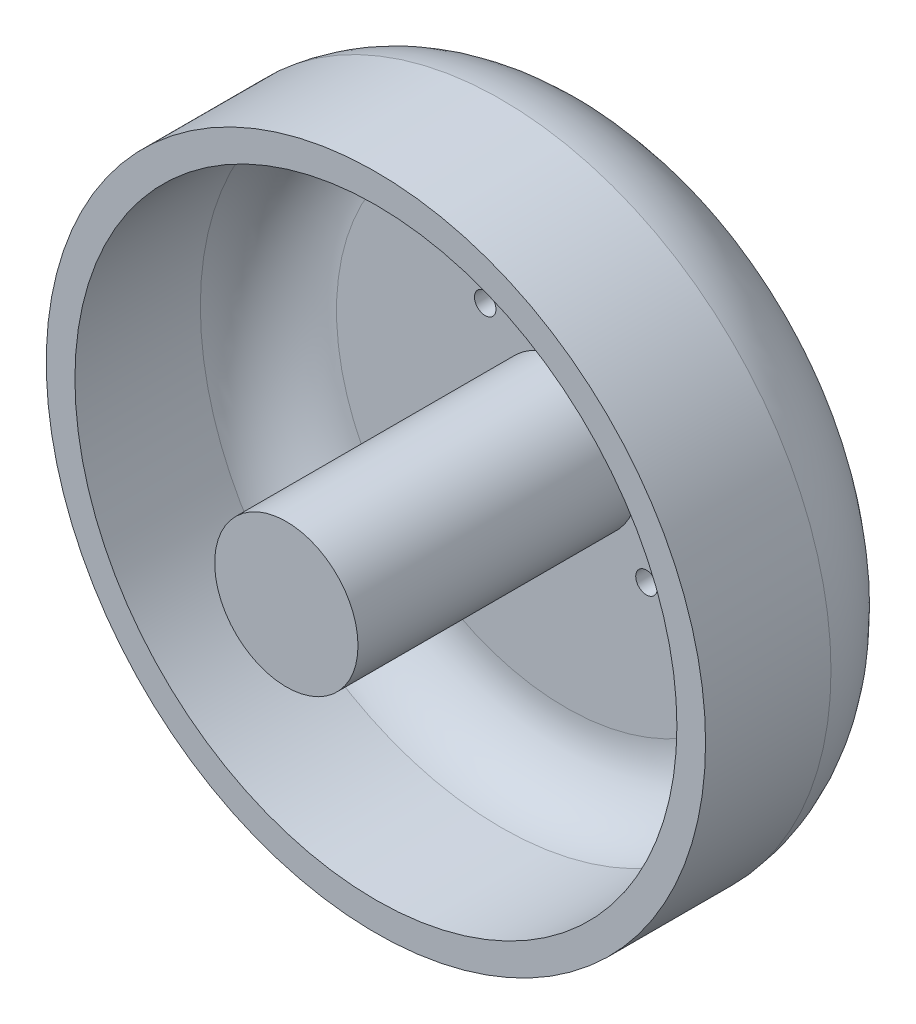
ISO-10303-21;
HEADER;
FILE_DESCRIPTION(('STEP AP214'),'2;1');
FILE_NAME('part.step','',(''),(''),'','','');
FILE_SCHEMA(('AUTOMOTIVE_DESIGN { 1 0 10303 214 1 1 1 1 }'));
ENDSEC;
DATA;
#1=APPLICATION_CONTEXT('core data for automotive mechanical design processes');
#2=APPLICATION_PROTOCOL_DEFINITION('international standard','automotive_design',2000,#1);
#3=PRODUCT_CONTEXT('',#1,'mechanical');
#4=PRODUCT('Part','Part','',(#3));
#5=PRODUCT_RELATED_PRODUCT_CATEGORY('part','',(#4));
#6=PRODUCT_DEFINITION_FORMATION('','',#4);
#7=PRODUCT_DEFINITION_CONTEXT('part definition',#1,'design');
#8=PRODUCT_DEFINITION('design','',#6,#7);
#9=PRODUCT_DEFINITION_SHAPE('','',#8);
#10=(LENGTH_UNIT() NAMED_UNIT(*) SI_UNIT(.MILLI.,.METRE.));
#11=(NAMED_UNIT(*) PLANE_ANGLE_UNIT() SI_UNIT($,.RADIAN.));
#12=(NAMED_UNIT(*) SI_UNIT($,.STERADIAN.) SOLID_ANGLE_UNIT());
#13=UNCERTAINTY_MEASURE_WITH_UNIT(LENGTH_MEASURE(1.E-05),#10,'distance_accuracy_value','');
#14=(GEOMETRIC_REPRESENTATION_CONTEXT(3) GLOBAL_UNCERTAINTY_ASSIGNED_CONTEXT((#13)) GLOBAL_UNIT_ASSIGNED_CONTEXT((#10,
#11,#12)) REPRESENTATION_CONTEXT('',''));
#15=CARTESIAN_POINT('',(0.,0.,0.));
#16=DIRECTION('',(0.,0.,1.));
#17=DIRECTION('',(1.,0.,0.));
#18=AXIS2_PLACEMENT_3D('',#15,#16,#17);
#19=CARTESIAN_POINT('',(0.,0.,45.));
#20=DIRECTION('',(0.,0.,-1.));
#21=DIRECTION('',(-1.,0.,0.));
#22=AXIS2_PLACEMENT_3D('',#19,#20,#21);
#23=PLANE('',#22);
#24=CARTESIAN_POINT('',(0.,0.,45.));
#25=DIRECTION('',(0.,0.,1.));
#26=DIRECTION('',(1.,0.,0.));
#27=AXIS2_PLACEMENT_3D('',#24,#25,#26);
#28=CIRCLE('',#27,9.99999999999999);
#29=CARTESIAN_POINT('',(9.99999999999999,0.,45.));
#30=VERTEX_POINT('',#29);
#31=EDGE_CURVE('E37',#30,#30,#28,.T.);
#32=ORIENTED_EDGE('',*,*,#31,.T.);
#33=EDGE_LOOP('',(#32));
#34=FACE_BOUND('',#33,.T.);
#35=ADVANCED_FACE('F31',(#34),#23,.F.);
#36=CARTESIAN_POINT('',(0.,0.,677.963129910302));
#37=DIRECTION('',(0.,0.,1.));
#38=DIRECTION('',(1.,0.,0.));
#39=AXIS2_PLACEMENT_3D('',#36,#37,#38);
#40=CYLINDRICAL_SURFACE('',#39,10.);
#41=ORIENTED_EDGE('',*,*,#31,.F.);
#42=EDGE_LOOP('',(#41));
#43=FACE_BOUND('',#42,.T.);
#44=CARTESIAN_POINT('',(0.,0.,6.00000000000001));
#45=DIRECTION('',(0.,0.,1.));
#46=DIRECTION('',(1.,0.,0.));
#47=AXIS2_PLACEMENT_3D('',#44,#45,#46);
#48=CIRCLE('',#47,10.);
#49=CARTESIAN_POINT('',(10.,0.,6.00000000000001));
#50=VERTEX_POINT('',#49);
#51=EDGE_CURVE('E41',#50,#50,#48,.T.);
#52=ORIENTED_EDGE('',*,*,#51,.T.);
#53=EDGE_LOOP('',(#52));
#54=FACE_BOUND('',#53,.T.);
#55=ADVANCED_FACE('F109',(#43,#54),#40,.T.);
#56=CARTESIAN_POINT('',(0.,10.,6.));
#57=DIRECTION('',(0.,0.,-1.));
#58=DIRECTION('',(-1.,0.,0.));
#59=AXIS2_PLACEMENT_3D('',#56,#57,#58);
#60=PLANE('',#59);
#61=CARTESIAN_POINT('',(11.25,-11.25,6.));
#62=DIRECTION('',(0.,0.,-1.));
#63=DIRECTION('',(-1.,0.,0.));
#64=AXIS2_PLACEMENT_3D('',#61,#62,#63);
#65=CIRCLE('',#64,1.5);
#66=CARTESIAN_POINT('',(9.75,-11.25,6.));
#67=VERTEX_POINT('',#66);
#68=EDGE_CURVE('E65',#67,#67,#65,.T.);
#69=ORIENTED_EDGE('',*,*,#68,.T.);
#70=EDGE_LOOP('',(#69));
#71=FACE_BOUND('',#70,.T.);
#72=CARTESIAN_POINT('',(-11.25,-11.25,6.));
#73=DIRECTION('',(0.,0.,-1.));
#74=DIRECTION('',(-1.,0.,0.));
#75=AXIS2_PLACEMENT_3D('',#72,#73,#74);
#76=CIRCLE('',#75,1.5);
#77=CARTESIAN_POINT('',(-12.75,-11.25,6.));
#78=VERTEX_POINT('',#77);
#79=EDGE_CURVE('E68',#78,#78,#76,.T.);
#80=ORIENTED_EDGE('',*,*,#79,.T.);
#81=EDGE_LOOP('',(#80));
#82=FACE_BOUND('',#81,.T.);
#83=CARTESIAN_POINT('',(-11.25,11.25,6.));
#84=DIRECTION('',(0.,0.,-1.));
#85=DIRECTION('',(-1.,0.,0.));
#86=AXIS2_PLACEMENT_3D('',#83,#84,#85);
#87=CIRCLE('',#86,1.5);
#88=CARTESIAN_POINT('',(-12.75,11.25,6.));
#89=VERTEX_POINT('',#88);
#90=EDGE_CURVE('E71',#89,#89,#87,.T.);
#91=ORIENTED_EDGE('',*,*,#90,.T.);
#92=EDGE_LOOP('',(#91));
#93=FACE_BOUND('',#92,.T.);
#94=CARTESIAN_POINT('',(11.25,11.25,6.));
#95=DIRECTION('',(0.,0.,-1.));
#96=DIRECTION('',(-1.,0.,0.));
#97=AXIS2_PLACEMENT_3D('',#94,#95,#96);
#98=CIRCLE('',#97,1.5);
#99=CARTESIAN_POINT('',(9.75,11.25,6.));
#100=VERTEX_POINT('',#99);
#101=EDGE_CURVE('E74',#100,#100,#98,.T.);
#102=ORIENTED_EDGE('',*,*,#101,.T.);
#103=EDGE_LOOP('',(#102));
#104=FACE_BOUND('',#103,.T.);
#105=ORIENTED_EDGE('',*,*,#51,.F.);
#106=EDGE_LOOP('',(#105));
#107=FACE_BOUND('',#106,.T.);
#108=CARTESIAN_POINT('',(0.,0.,6.00000000000001));
#109=DIRECTION('',(0.,0.,1.));
#110=DIRECTION('',(1.,0.,0.));
#111=AXIS2_PLACEMENT_3D('',#108,#109,#110);
#112=CIRCLE('',#111,32.);
#113=CARTESIAN_POINT('',(32.,0.,6.00000000000001));
#114=VERTEX_POINT('',#113);
#115=EDGE_CURVE('E45',#114,#114,#112,.T.);
#116=ORIENTED_EDGE('',*,*,#115,.T.);
#117=EDGE_LOOP('',(#116));
#118=FACE_BOUND('',#117,.T.);
#119=ADVANCED_FACE('F113',(#71,#82,#93,#104,#107,#118),#60,.F.);
#120=CARTESIAN_POINT('',(0.,0.,15.9998744335239));
#121=DIRECTION('',(0.,0.,1.));
#122=DIRECTION('',(1.,0.,0.));
#123=AXIS2_PLACEMENT_3D('',#120,#121,#122);
#124=TOROIDAL_SURFACE('',#123,32.0501130098285,10.);
#125=ORIENTED_EDGE('',*,*,#115,.F.);
#126=EDGE_LOOP('',(#125));
#127=FACE_BOUND('',#126,.T.);
#128=CARTESIAN_POINT('',(0.,0.,15.));
#129=DIRECTION('',(0.,0.,1.));
#130=DIRECTION('',(1.,0.,0.));
#131=AXIS2_PLACEMENT_3D('',#128,#129,#130);
#132=CIRCLE('',#131,42.);
#133=CARTESIAN_POINT('',(42.,0.,15.));
#134=VERTEX_POINT('',#133);
#135=EDGE_CURVE('E50',#134,#134,#132,.T.);
#136=ORIENTED_EDGE('',*,*,#135,.T.);
#137=EDGE_LOOP('',(#136));
#138=FACE_BOUND('',#137,.T.);
#139=ADVANCED_FACE('F118',(#127,#138),#124,.F.);
#140=CARTESIAN_POINT('',(0.,0.,677.963129910302));
#141=DIRECTION('',(0.,0.,1.));
#142=DIRECTION('',(1.,0.,0.));
#143=AXIS2_PLACEMENT_3D('',#140,#141,#142);
#144=CYLINDRICAL_SURFACE('',#143,42.);
#145=ORIENTED_EDGE('',*,*,#135,.F.);
#146=EDGE_LOOP('',(#145));
#147=FACE_BOUND('',#146,.T.);
#148=CARTESIAN_POINT('',(0.,0.,32.5));
#149=DIRECTION('',(0.,0.,1.));
#150=DIRECTION('',(1.,0.,0.));
#151=AXIS2_PLACEMENT_3D('',#148,#149,#150);
#152=CIRCLE('',#151,42.);
#153=CARTESIAN_POINT('',(42.,0.,32.5));
#154=VERTEX_POINT('',#153);
#155=EDGE_CURVE('E53',#154,#154,#152,.T.);
#156=ORIENTED_EDGE('',*,*,#155,.T.);
#157=EDGE_LOOP('',(#156));
#158=FACE_BOUND('',#157,.T.);
#159=ADVANCED_FACE('F125',(#147,#158),#144,.F.);
#160=CARTESIAN_POINT('',(0.,42.,32.5));
#161=DIRECTION('',(0.,0.,-1.));
#162=DIRECTION('',(-1.,0.,0.));
#163=AXIS2_PLACEMENT_3D('',#160,#161,#162);
#164=PLANE('',#163);
#165=ORIENTED_EDGE('',*,*,#155,.F.);
#166=EDGE_LOOP('',(#165));
#167=FACE_BOUND('',#166,.T.);
#168=CARTESIAN_POINT('',(0.,0.,32.5));
#169=DIRECTION('',(0.,0.,1.));
#170=DIRECTION('',(1.,0.,0.));
#171=AXIS2_PLACEMENT_3D('',#168,#169,#170);
#172=CIRCLE('',#171,46.);
#173=CARTESIAN_POINT('',(46.,0.,32.5));
#174=VERTEX_POINT('',#173);
#175=EDGE_CURVE('E56',#174,#174,#172,.T.);
#176=ORIENTED_EDGE('',*,*,#175,.T.);
#177=EDGE_LOOP('',(#176));
#178=FACE_BOUND('',#177,.T.);
#179=ADVANCED_FACE('F129',(#167,#178),#164,.F.);
#180=CARTESIAN_POINT('',(0.,0.,677.963129910302));
#181=DIRECTION('',(0.,0.,1.));
#182=DIRECTION('',(1.,0.,0.));
#183=AXIS2_PLACEMENT_3D('',#180,#181,#182);
#184=CYLINDRICAL_SURFACE('',#183,46.);
#185=ORIENTED_EDGE('',*,*,#175,.F.);
#186=EDGE_LOOP('',(#185));
#187=FACE_BOUND('',#186,.T.);
#188=CARTESIAN_POINT('',(0.,0.,15.));
#189=DIRECTION('',(0.,0.,1.));
#190=DIRECTION('',(1.,0.,0.));
#191=AXIS2_PLACEMENT_3D('',#188,#189,#190);
#192=CIRCLE('',#191,46.);
#193=CARTESIAN_POINT('',(46.,0.,15.));
#194=VERTEX_POINT('',#193);
#195=EDGE_CURVE('E59',#194,#194,#192,.T.);
#196=ORIENTED_EDGE('',*,*,#195,.T.);
#197=EDGE_LOOP('',(#196));
#198=FACE_BOUND('',#197,.T.);
#199=ADVANCED_FACE('F133',(#187,#198),#184,.T.);
#200=CARTESIAN_POINT('',(0.,0.,16.749125271602));
#201=DIRECTION('',(0.,0.,1.));
#202=DIRECTION('',(1.,0.,0.));
#203=AXIS2_PLACEMENT_3D('',#200,#201,#202);
#204=TOROIDAL_SURFACE('',#203,29.0902229232836,17.);
#205=ORIENTED_EDGE('',*,*,#195,.F.);
#206=EDGE_LOOP('',(#205));
#207=FACE_BOUND('',#206,.T.);
#208=CARTESIAN_POINT('',(0.,0.,0.));
#209=DIRECTION('',(0.,0.,1.));
#210=DIRECTION('',(1.,0.,0.));
#211=AXIS2_PLACEMENT_3D('',#208,#209,#210);
#212=CIRCLE('',#211,32.);
#213=CARTESIAN_POINT('',(32.,0.,0.));
#214=VERTEX_POINT('',#213);
#215=EDGE_CURVE('E62',#214,#214,#212,.T.);
#216=ORIENTED_EDGE('',*,*,#215,.T.);
#217=EDGE_LOOP('',(#216));
#218=FACE_BOUND('',#217,.T.);
#219=ADVANCED_FACE('F137',(#207,#218),#204,.T.);
#220=CARTESIAN_POINT('',(0.,0.,0.));
#221=DIRECTION('',(0.,0.,1.));
#222=DIRECTION('',(1.,0.,0.));
#223=AXIS2_PLACEMENT_3D('',#220,#221,#222);
#224=PLANE('',#223);
#225=CARTESIAN_POINT('',(0.,0.,0.));
#226=DIRECTION('',(0.,0.,1.));
#227=DIRECTION('',(1.,0.,0.));
#228=AXIS2_PLACEMENT_3D('',#225,#226,#227);
#229=CIRCLE('',#228,1.5);
#230=CARTESIAN_POINT('',(1.5,0.,0.));
#231=VERTEX_POINT('',#230);
#232=EDGE_CURVE('E10',#231,#231,#229,.F.);
#233=ORIENTED_EDGE('',*,*,#232,.F.);
#234=EDGE_LOOP('',(#233));
#235=FACE_BOUND('',#234,.T.);
#236=CARTESIAN_POINT('',(11.25,-11.25,0.));
#237=DIRECTION('',(0.,0.,-1.));
#238=DIRECTION('',(-1.,0.,0.));
#239=AXIS2_PLACEMENT_3D('',#236,#237,#238);
#240=CIRCLE('',#239,1.5);
#241=CARTESIAN_POINT('',(9.75,-11.25,0.));
#242=VERTEX_POINT('',#241);
#243=EDGE_CURVE('E81',#242,#242,#240,.T.);
#244=ORIENTED_EDGE('',*,*,#243,.F.);
#245=EDGE_LOOP('',(#244));
#246=FACE_BOUND('',#245,.T.);
#247=CARTESIAN_POINT('',(-11.25,-11.25,0.));
#248=DIRECTION('',(0.,0.,-1.));
#249=DIRECTION('',(-1.,0.,0.));
#250=AXIS2_PLACEMENT_3D('',#247,#248,#249);
#251=CIRCLE('',#250,1.5);
#252=CARTESIAN_POINT('',(-12.75,-11.25,0.));
#253=VERTEX_POINT('',#252);
#254=EDGE_CURVE('E84',#253,#253,#251,.T.);
#255=ORIENTED_EDGE('',*,*,#254,.F.);
#256=EDGE_LOOP('',(#255));
#257=FACE_BOUND('',#256,.T.);
#258=CARTESIAN_POINT('',(-11.25,11.25,0.));
#259=DIRECTION('',(0.,0.,-1.));
#260=DIRECTION('',(-1.,0.,0.));
#261=AXIS2_PLACEMENT_3D('',#258,#259,#260);
#262=CIRCLE('',#261,1.5);
#263=CARTESIAN_POINT('',(-12.75,11.25,0.));
#264=VERTEX_POINT('',#263);
#265=EDGE_CURVE('E80',#264,#264,#262,.T.);
#266=ORIENTED_EDGE('',*,*,#265,.F.);
#267=EDGE_LOOP('',(#266));
#268=FACE_BOUND('',#267,.T.);
#269=CARTESIAN_POINT('',(11.25,11.25,0.));
#270=DIRECTION('',(0.,0.,-1.));
#271=DIRECTION('',(-1.,0.,0.));
#272=AXIS2_PLACEMENT_3D('',#269,#270,#271);
#273=CIRCLE('',#272,1.5);
#274=CARTESIAN_POINT('',(9.75,11.25,0.));
#275=VERTEX_POINT('',#274);
#276=EDGE_CURVE('E77',#275,#275,#273,.T.);
#277=ORIENTED_EDGE('',*,*,#276,.F.);
#278=EDGE_LOOP('',(#277));
#279=FACE_BOUND('',#278,.T.);
#280=ORIENTED_EDGE('',*,*,#215,.F.);
#281=EDGE_LOOP('',(#280));
#282=FACE_BOUND('',#281,.T.);
#283=ADVANCED_FACE('F141',(#235,#246,#257,#268,#279,#282),#224,.F.);
#284=CARTESIAN_POINT('',(11.25,11.25,45.));
#285=DIRECTION('',(0.,0.,-1.));
#286=DIRECTION('',(-1.,0.,0.));
#287=AXIS2_PLACEMENT_3D('',#284,#285,#286);
#288=CYLINDRICAL_SURFACE('',#287,1.5);
#289=ORIENTED_EDGE('',*,*,#276,.T.);
#290=EDGE_LOOP('',(#289));
#291=FACE_BOUND('',#290,.T.);
#292=ORIENTED_EDGE('',*,*,#101,.F.);
#293=EDGE_LOOP('',(#292));
#294=FACE_BOUND('',#293,.T.);
#295=ADVANCED_FACE('F145',(#291,#294),#288,.F.);
#296=CARTESIAN_POINT('',(-11.25,11.25,45.));
#297=DIRECTION('',(0.,0.,-1.));
#298=DIRECTION('',(-1.,0.,0.));
#299=AXIS2_PLACEMENT_3D('',#296,#297,#298);
#300=CYLINDRICAL_SURFACE('',#299,1.5);
#301=ORIENTED_EDGE('',*,*,#265,.T.);
#302=EDGE_LOOP('',(#301));
#303=FACE_BOUND('',#302,.T.);
#304=ORIENTED_EDGE('',*,*,#90,.F.);
#305=EDGE_LOOP('',(#304));
#306=FACE_BOUND('',#305,.T.);
#307=ADVANCED_FACE('F148',(#303,#306),#300,.F.);
#308=CARTESIAN_POINT('',(-11.25,-11.25,45.));
#309=DIRECTION('',(0.,0.,-1.));
#310=DIRECTION('',(-1.,0.,0.));
#311=AXIS2_PLACEMENT_3D('',#308,#309,#310);
#312=CYLINDRICAL_SURFACE('',#311,1.5);
#313=ORIENTED_EDGE('',*,*,#254,.T.);
#314=EDGE_LOOP('',(#313));
#315=FACE_BOUND('',#314,.T.);
#316=ORIENTED_EDGE('',*,*,#79,.F.);
#317=EDGE_LOOP('',(#316));
#318=FACE_BOUND('',#317,.T.);
#319=ADVANCED_FACE('F104',(#315,#318),#312,.F.);
#320=CARTESIAN_POINT('',(11.25,-11.25,45.));
#321=DIRECTION('',(0.,0.,-1.));
#322=DIRECTION('',(-1.,0.,0.));
#323=AXIS2_PLACEMENT_3D('',#320,#321,#322);
#324=CYLINDRICAL_SURFACE('',#323,1.5);
#325=ORIENTED_EDGE('',*,*,#243,.T.);
#326=EDGE_LOOP('',(#325));
#327=FACE_BOUND('',#326,.T.);
#328=ORIENTED_EDGE('',*,*,#68,.F.);
#329=EDGE_LOOP('',(#328));
#330=FACE_BOUND('',#329,.T.);
#331=ADVANCED_FACE('F97',(#327,#330),#324,.F.);
#332=CARTESIAN_POINT('',(0.,0.,-6.));
#333=DIRECTION('',(0.,0.,1.));
#334=DIRECTION('',(1.,0.,0.));
#335=AXIS2_PLACEMENT_3D('',#332,#333,#334);
#336=CYLINDRICAL_SURFACE('',#335,1.5);
#337=CARTESIAN_POINT('',(0.,0.,-6.));
#338=DIRECTION('',(0.,0.,-1.));
#339=DIRECTION('',(-1.,0.,0.));
#340=AXIS2_PLACEMENT_3D('',#337,#338,#339);
#341=CIRCLE('',#340,1.5);
#342=CARTESIAN_POINT('',(-1.5,0.,-6.));
#343=VERTEX_POINT('',#342);
#344=EDGE_CURVE('E85',#343,#343,#341,.T.);
#345=ORIENTED_EDGE('',*,*,#344,.F.);
#346=EDGE_LOOP('',(#345));
#347=FACE_BOUND('',#346,.T.);
#348=ORIENTED_EDGE('',*,*,#232,.T.);
#349=EDGE_LOOP('',(#348));
#350=FACE_BOUND('',#349,.T.);
#351=ADVANCED_FACE('F95',(#347,#350),#336,.T.);
#352=CARTESIAN_POINT('',(0.,0.,-6.));
#353=DIRECTION('',(0.,0.,-1.));
#354=DIRECTION('',(-1.,0.,0.));
#355=AXIS2_PLACEMENT_3D('',#352,#353,#354);
#356=PLANE('',#355);
#357=ORIENTED_EDGE('',*,*,#344,.T.);
#358=EDGE_LOOP('',(#357));
#359=FACE_BOUND('',#358,.T.);
#360=ADVANCED_FACE('F93',(#359),#356,.T.);
#361=CLOSED_SHELL('',(#35,#55,#119,#139,#159,#179,#199,#219,#283,#295,#307,#319,#331,#351,#360));
#362=MANIFOLD_SOLID_BREP('B2',#361);
#363=ADVANCED_BREP_SHAPE_REPRESENTATION('',(#18,#362),#14);
#364=SHAPE_DEFINITION_REPRESENTATION(#9,#363);
ENDSEC;
END-ISO-10303-21;
